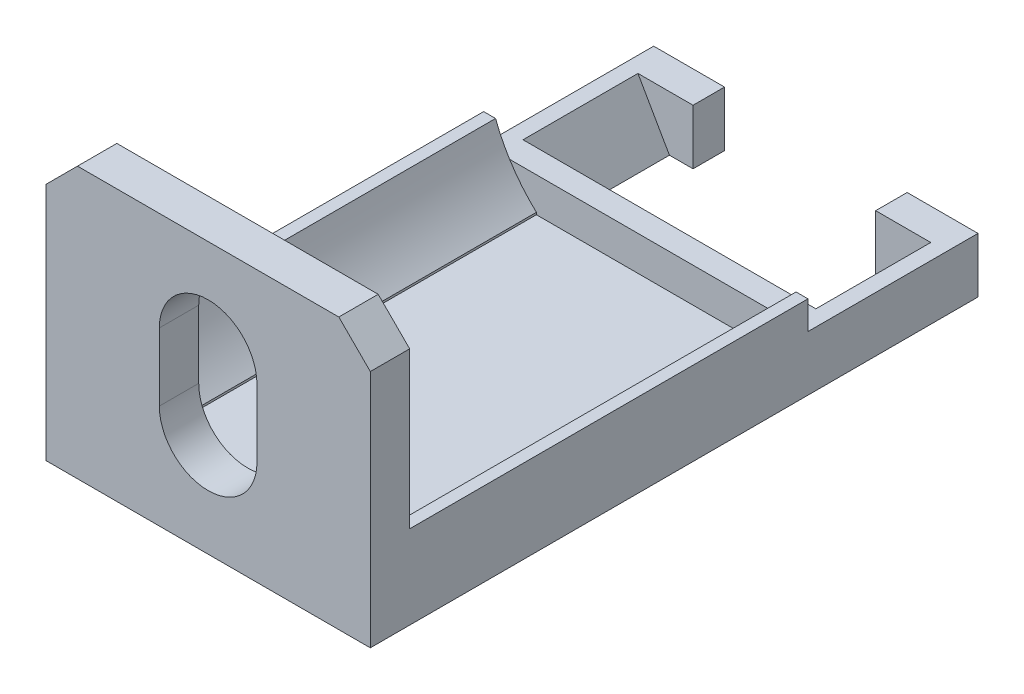
ISO-10303-21;
HEADER;
FILE_DESCRIPTION(('STEP AP214'),'2;1');
FILE_NAME('part.step','',(''),(''),'','','');
FILE_SCHEMA(('AUTOMOTIVE_DESIGN { 1 0 10303 214 1 1 1 1 }'));
ENDSEC;
DATA;
#1=APPLICATION_CONTEXT('core data for automotive mechanical design processes');
#2=APPLICATION_PROTOCOL_DEFINITION('international standard','automotive_design',2000,#1);
#3=PRODUCT_CONTEXT('',#1,'mechanical');
#4=PRODUCT('Part','Part','',(#3));
#5=PRODUCT_RELATED_PRODUCT_CATEGORY('part','',(#4));
#6=PRODUCT_DEFINITION_FORMATION('','',#4);
#7=PRODUCT_DEFINITION_CONTEXT('part definition',#1,'design');
#8=PRODUCT_DEFINITION('design','',#6,#7);
#9=PRODUCT_DEFINITION_SHAPE('','',#8);
#10=(LENGTH_UNIT() NAMED_UNIT(*) SI_UNIT(.MILLI.,.METRE.));
#11=(NAMED_UNIT(*) PLANE_ANGLE_UNIT() SI_UNIT($,.RADIAN.));
#12=(NAMED_UNIT(*) SI_UNIT($,.STERADIAN.) SOLID_ANGLE_UNIT());
#13=UNCERTAINTY_MEASURE_WITH_UNIT(LENGTH_MEASURE(1.E-05),#10,'distance_accuracy_value','');
#14=(GEOMETRIC_REPRESENTATION_CONTEXT(3) GLOBAL_UNCERTAINTY_ASSIGNED_CONTEXT((#13)) GLOBAL_UNIT_ASSIGNED_CONTEXT((#10,
#11,#12)) REPRESENTATION_CONTEXT('',''));
#15=CARTESIAN_POINT('',(0.,0.,0.));
#16=DIRECTION('',(0.,0.,1.));
#17=DIRECTION('',(1.,0.,0.));
#18=AXIS2_PLACEMENT_3D('',#15,#16,#17);
#19=CARTESIAN_POINT('',(0.,0.,-26.8));
#20=DIRECTION('',(0.,0.,1.));
#21=DIRECTION('',(1.,0.,0.));
#22=AXIS2_PLACEMENT_3D('',#19,#20,#21);
#23=PLANE('',#22);
#24=DIRECTION('',(0.496138938356835,-0.868243142124459,0.));
#25=VECTOR('',#24,1.);
#26=CARTESIAN_POINT('',(-9.3,-5.10000000000001,-26.8));
#27=LINE('',#26,#25);
#28=CARTESIAN_POINT('',(-9.3,-5.10000000000001,-26.8));
#29=VERTEX_POINT('',#28);
#30=CARTESIAN_POINT('',(-7.29999999999999,-8.6,-26.8));
#31=VERTEX_POINT('',#30);
#32=EDGE_CURVE('E276',#29,#31,#27,.T.);
#33=ORIENTED_EDGE('',*,*,#32,.F.);
#34=DIRECTION('',(1.,0.,0.));
#35=VECTOR('',#34,1.);
#36=CARTESIAN_POINT('',(10.3,-5.1,-26.8));
#37=LINE('',#36,#35);
#38=CARTESIAN_POINT('',(9.3,-5.1,-26.8));
#39=VERTEX_POINT('',#38);
#40=EDGE_CURVE('E359',#29,#39,#37,.T.);
#41=ORIENTED_EDGE('',*,*,#40,.T.);
#42=DIRECTION('',(0.496138938356834,0.868243142124459,0.));
#43=VECTOR('',#42,1.);
#44=CARTESIAN_POINT('',(9.3,-5.1,-26.8));
#45=LINE('',#44,#43);
#46=CARTESIAN_POINT('',(7.3,-8.6,-26.8));
#47=VERTEX_POINT('',#46);
#48=EDGE_CURVE('E291',#47,#39,#45,.T.);
#49=ORIENTED_EDGE('',*,*,#48,.F.);
#50=DIRECTION('',(-1.,0.,0.));
#51=VECTOR('',#50,1.);
#52=CARTESIAN_POINT('',(10.3,-8.6,-26.8));
#53=LINE('',#52,#51);
#54=EDGE_CURVE('E357',#47,#31,#53,.T.);
#55=ORIENTED_EDGE('',*,*,#54,.T.);
#56=EDGE_LOOP('',(#33,#41,#49,#55));
#57=FACE_BOUND('',#56,.T.);
#58=ADVANCED_FACE('F37',(#57),#23,.F.);
#59=CARTESIAN_POINT('',(-6.95,-3.3,0.));
#60=DIRECTION('',(-1.,0.,0.));
#61=DIRECTION('',(0.,0.,1.));
#62=AXIS2_PLACEMENT_3D('',#59,#60,#61);
#63=PLANE('',#62);
#64=DIRECTION('',(0.,0.,1.));
#65=VECTOR('',#64,1.);
#66=CARTESIAN_POINT('',(-6.95,-7.16575515269554,-51.1644543727487));
#67=LINE('',#66,#65);
#68=CARTESIAN_POINT('',(-6.95,-7.16575515269554,0.));
#69=VERTEX_POINT('',#68);
#70=CARTESIAN_POINT('',(-6.95,-7.16575515269554,-25.3));
#71=VERTEX_POINT('',#70);
#72=EDGE_CURVE('E319',#69,#71,#67,.F.);
#73=ORIENTED_EDGE('',*,*,#72,.F.);
#74=DIRECTION('',(0.,-1.,0.));
#75=VECTOR('',#74,1.);
#76=CARTESIAN_POINT('',(-6.95,-3.3,0.));
#77=LINE('',#76,#75);
#78=CARTESIAN_POINT('',(-6.95,-7.3,0.));
#79=VERTEX_POINT('',#78);
#80=EDGE_CURVE('E354',#69,#79,#77,.T.);
#81=ORIENTED_EDGE('',*,*,#80,.T.);
#82=DIRECTION('',(0.,0.,-1.));
#83=VECTOR('',#82,1.);
#84=CARTESIAN_POINT('',(-6.95,-7.3,0.));
#85=LINE('',#84,#83);
#86=CARTESIAN_POINT('',(-6.95,-7.3,-25.3));
#87=VERTEX_POINT('',#86);
#88=EDGE_CURVE('E340',#79,#87,#85,.T.);
#89=ORIENTED_EDGE('',*,*,#88,.T.);
#90=DIRECTION('',(0.,-1.,0.));
#91=VECTOR('',#90,1.);
#92=CARTESIAN_POINT('',(-6.95,0.,-25.3));
#93=LINE('',#92,#91);
#94=EDGE_CURVE('E427',#71,#87,#93,.T.);
#95=ORIENTED_EDGE('',*,*,#94,.F.);
#96=EDGE_LOOP('',(#73,#81,#89,#95));
#97=FACE_BOUND('',#96,.T.);
#98=ADVANCED_FACE('F524',(#97),#63,.F.);
#99=CARTESIAN_POINT('',(0.,-3.3,0.));
#100=DIRECTION('',(0.,1.,0.));
#101=DIRECTION('',(-1.,0.,0.));
#102=AXIS2_PLACEMENT_3D('',#99,#100,#101);
#103=PLANE('',#102);
#104=DIRECTION('',(1.,0.,0.));
#105=VECTOR('',#104,1.);
#106=CARTESIAN_POINT('',(0.,-3.3,0.));
#107=LINE('',#106,#105);
#108=CARTESIAN_POINT('',(-10.3,-3.3,0.));
#109=VERTEX_POINT('',#108);
#110=CARTESIAN_POINT('',(-9.54358423235212,-3.3,0.));
#111=VERTEX_POINT('',#110);
#112=EDGE_CURVE('E341',#109,#111,#107,.T.);
#113=ORIENTED_EDGE('',*,*,#112,.T.);
#114=DIRECTION('',(0.,0.,1.));
#115=VECTOR('',#114,1.);
#116=CARTESIAN_POINT('',(-9.54358423235212,-3.3,-51.1644543727487));
#117=LINE('',#116,#115);
#118=CARTESIAN_POINT('',(-9.54358423235212,-3.3,-25.3));
#119=VERTEX_POINT('',#118);
#120=EDGE_CURVE('E432',#111,#119,#117,.F.);
#121=ORIENTED_EDGE('',*,*,#120,.T.);
#122=DIRECTION('',(-1.,0.,0.));
#123=VECTOR('',#122,1.);
#124=CARTESIAN_POINT('',(0.,-3.3,-25.3));
#125=LINE('',#124,#123);
#126=CARTESIAN_POINT('',(-10.3,-3.3,-25.3));
#127=VERTEX_POINT('',#126);
#128=EDGE_CURVE('E344',#119,#127,#125,.T.);
#129=ORIENTED_EDGE('',*,*,#128,.T.);
#130=DIRECTION('',(0.,0.,1.));
#131=VECTOR('',#130,1.);
#132=CARTESIAN_POINT('',(-10.3,-3.3,0.));
#133=LINE('',#132,#131);
#134=EDGE_CURVE('E346',#127,#109,#133,.T.);
#135=ORIENTED_EDGE('',*,*,#134,.T.);
#136=EDGE_LOOP('',(#113,#121,#129,#135));
#137=FACE_BOUND('',#136,.T.);
#138=ADVANCED_FACE('F518',(#137),#103,.T.);
#139=CARTESIAN_POINT('',(6.95,-3.3,0.));
#140=DIRECTION('',(-1.,0.,0.));
#141=DIRECTION('',(0.,0.,1.));
#142=AXIS2_PLACEMENT_3D('',#139,#140,#141);
#143=PLANE('',#142);
#144=DIRECTION('',(0.,-1.,0.));
#145=VECTOR('',#144,1.);
#146=CARTESIAN_POINT('',(6.95,-3.3,0.));
#147=LINE('',#146,#145);
#148=CARTESIAN_POINT('',(6.95,-7.16575515269554,0.));
#149=VERTEX_POINT('',#148);
#150=CARTESIAN_POINT('',(6.95,-7.3,0.));
#151=VERTEX_POINT('',#150);
#152=EDGE_CURVE('E337',#149,#151,#147,.T.);
#153=ORIENTED_EDGE('',*,*,#152,.F.);
#154=DIRECTION('',(0.,0.,1.));
#155=VECTOR('',#154,1.);
#156=CARTESIAN_POINT('',(6.95,-7.16575515269554,-51.1644543727487));
#157=LINE('',#156,#155);
#158=CARTESIAN_POINT('',(6.95,-7.16575515269554,-25.3));
#159=VERTEX_POINT('',#158);
#160=EDGE_CURVE('E316',#149,#159,#157,.F.);
#161=ORIENTED_EDGE('',*,*,#160,.T.);
#162=DIRECTION('',(0.,-1.,0.));
#163=VECTOR('',#162,1.);
#164=CARTESIAN_POINT('',(6.95,-3.3,-25.3));
#165=LINE('',#164,#163);
#166=CARTESIAN_POINT('',(6.95,-7.3,-25.3));
#167=VERTEX_POINT('',#166);
#168=EDGE_CURVE('E329',#159,#167,#165,.T.);
#169=ORIENTED_EDGE('',*,*,#168,.T.);
#170=DIRECTION('',(0.,0.,-1.));
#171=VECTOR('',#170,1.);
#172=CARTESIAN_POINT('',(6.95,-7.3,0.));
#173=LINE('',#172,#171);
#174=EDGE_CURVE('E321',#151,#167,#173,.T.);
#175=ORIENTED_EDGE('',*,*,#174,.F.);
#176=EDGE_LOOP('',(#153,#161,#169,#175));
#177=FACE_BOUND('',#176,.T.);
#178=ADVANCED_FACE('F545',(#177),#143,.T.);
#179=CARTESIAN_POINT('',(0.,-3.3,0.));
#180=DIRECTION('',(0.,1.,0.));
#181=DIRECTION('',(-1.,0.,0.));
#182=AXIS2_PLACEMENT_3D('',#179,#180,#181);
#183=PLANE('',#182);
#184=DIRECTION('',(-1.,0.,0.));
#185=VECTOR('',#184,1.);
#186=CARTESIAN_POINT('',(0.,-3.3,-25.3));
#187=LINE('',#186,#185);
#188=CARTESIAN_POINT('',(10.3,-3.3,-25.3));
#189=VERTEX_POINT('',#188);
#190=CARTESIAN_POINT('',(9.54358423235212,-3.3,-25.3));
#191=VERTEX_POINT('',#190);
#192=EDGE_CURVE('E326',#189,#191,#187,.T.);
#193=ORIENTED_EDGE('',*,*,#192,.T.);
#194=DIRECTION('',(0.,0.,1.));
#195=VECTOR('',#194,1.);
#196=CARTESIAN_POINT('',(9.54358423235212,-3.3,-51.1644543727487));
#197=LINE('',#196,#195);
#198=CARTESIAN_POINT('',(9.54358423235212,-3.3,0.));
#199=VERTEX_POINT('',#198);
#200=EDGE_CURVE('E429',#191,#199,#197,.T.);
#201=ORIENTED_EDGE('',*,*,#200,.T.);
#202=DIRECTION('',(1.,0.,0.));
#203=VECTOR('',#202,1.);
#204=CARTESIAN_POINT('',(0.,-3.3,0.));
#205=LINE('',#204,#203);
#206=CARTESIAN_POINT('',(10.3,-3.3,0.));
#207=VERTEX_POINT('',#206);
#208=EDGE_CURVE('E322',#199,#207,#205,.T.);
#209=ORIENTED_EDGE('',*,*,#208,.T.);
#210=DIRECTION('',(0.,0.,-1.));
#211=VECTOR('',#210,1.);
#212=CARTESIAN_POINT('',(10.3,-3.3,0.));
#213=LINE('',#212,#211);
#214=EDGE_CURVE('E324',#207,#189,#213,.T.);
#215=ORIENTED_EDGE('',*,*,#214,.T.);
#216=EDGE_LOOP('',(#193,#201,#209,#215));
#217=FACE_BOUND('',#216,.T.);
#218=ADVANCED_FACE('F541',(#217),#183,.T.);
#219=CARTESIAN_POINT('',(0.,0.,0.));
#220=DIRECTION('',(0.,0.,-1.));
#221=DIRECTION('',(-1.,0.,0.));
#222=AXIS2_PLACEMENT_3D('',#219,#220,#221);
#223=PLANE('',#222);
#224=DIRECTION('',(0.,-1.,0.));
#225=VECTOR('',#224,1.);
#226=CARTESIAN_POINT('',(-10.3,-8.6,0.));
#227=LINE('',#226,#225);
#228=CARTESIAN_POINT('',(-10.3,6.6,0.));
#229=VERTEX_POINT('',#228);
#230=EDGE_CURVE('E410',#229,#109,#227,.T.);
#231=ORIENTED_EDGE('',*,*,#230,.F.);
#232=DIRECTION('',(-0.707106781186549,-0.707106781186546,0.));
#233=VECTOR('',#232,1.);
#234=CARTESIAN_POINT('',(-8.44999999999998,8.45000000000001,0.));
#235=LINE('',#234,#233);
#236=CARTESIAN_POINT('',(-8.3,8.6,0.));
#237=VERTEX_POINT('',#236);
#238=EDGE_CURVE('E440',#229,#237,#235,.F.);
#239=ORIENTED_EDGE('',*,*,#238,.T.);
#240=DIRECTION('',(-1.,0.,0.));
#241=VECTOR('',#240,1.);
#242=CARTESIAN_POINT('',(-10.3,8.6,0.));
#243=LINE('',#242,#241);
#244=CARTESIAN_POINT('',(8.3,8.6,0.));
#245=VERTEX_POINT('',#244);
#246=EDGE_CURVE('E420',#245,#237,#243,.T.);
#247=ORIENTED_EDGE('',*,*,#246,.F.);
#248=DIRECTION('',(-0.707106781186546,0.707106781186549,0.));
#249=VECTOR('',#248,1.);
#250=CARTESIAN_POINT('',(8.45000000000002,8.44999999999999,0.));
#251=LINE('',#250,#249);
#252=CARTESIAN_POINT('',(10.3,6.59999999999999,0.));
#253=VERTEX_POINT('',#252);
#254=EDGE_CURVE('E438',#245,#253,#251,.F.);
#255=ORIENTED_EDGE('',*,*,#254,.T.);
#256=DIRECTION('',(0.,1.,0.));
#257=VECTOR('',#256,1.);
#258=CARTESIAN_POINT('',(10.3,-8.6,0.));
#259=LINE('',#258,#257);
#260=EDGE_CURVE('E405',#207,#253,#259,.T.);
#261=ORIENTED_EDGE('',*,*,#260,.F.);
#262=ORIENTED_EDGE('',*,*,#208,.F.);
#263=CARTESIAN_POINT('',(0.,0.3,0.));
#264=DIRECTION('',(0.,0.,-1.));
#265=DIRECTION('',(-1.,0.,0.));
#266=AXIS2_PLACEMENT_3D('',#263,#264,#265);
#267=CIRCLE('',#266,10.2);
#268=EDGE_CURVE('E304',#199,#149,#267,.T.);
#269=ORIENTED_EDGE('',*,*,#268,.T.);
#270=ORIENTED_EDGE('',*,*,#152,.T.);
#271=DIRECTION('',(1.,0.,0.));
#272=VECTOR('',#271,1.);
#273=CARTESIAN_POINT('',(10.3,-7.3,0.));
#274=LINE('',#273,#272);
#275=EDGE_CURVE('E370',#79,#151,#274,.T.);
#276=ORIENTED_EDGE('',*,*,#275,.F.);
#277=ORIENTED_EDGE('',*,*,#80,.F.);
#278=EDGE_CURVE('E310',#69,#111,#267,.T.);
#279=ORIENTED_EDGE('',*,*,#278,.T.);
#280=ORIENTED_EDGE('',*,*,#112,.F.);
#281=EDGE_LOOP('',(#231,#239,#247,#255,#261,#262,#269,#270,#276,#277,#279,#280));
#282=FACE_BOUND('',#281,.T.);
#283=DIRECTION('',(0.,1.,0.));
#284=VECTOR('',#283,1.);
#285=CARTESIAN_POINT('',(3.1,2.3,0.));
#286=LINE('',#285,#284);
#287=CARTESIAN_POINT('',(3.1,-2.,0.));
#288=VERTEX_POINT('',#287);
#289=CARTESIAN_POINT('',(3.1,2.3,0.));
#290=VERTEX_POINT('',#289);
#291=EDGE_CURVE('E378',#288,#290,#286,.T.);
#292=ORIENTED_EDGE('',*,*,#291,.T.);
#293=CARTESIAN_POINT('',(0.,2.3,0.));
#294=DIRECTION('',(0.,0.,1.));
#295=DIRECTION('',(1.,0.,0.));
#296=AXIS2_PLACEMENT_3D('',#293,#294,#295);
#297=CIRCLE('',#296,3.1);
#298=CARTESIAN_POINT('',(-3.1,2.3,0.));
#299=VERTEX_POINT('',#298);
#300=EDGE_CURVE('E373',#290,#299,#297,.T.);
#301=ORIENTED_EDGE('',*,*,#300,.T.);
#302=DIRECTION('',(0.,-1.,0.));
#303=VECTOR('',#302,1.);
#304=CARTESIAN_POINT('',(-3.1,2.3,0.));
#305=LINE('',#304,#303);
#306=CARTESIAN_POINT('',(-3.1,-2.,0.));
#307=VERTEX_POINT('',#306);
#308=EDGE_CURVE('E388',#299,#307,#305,.T.);
#309=ORIENTED_EDGE('',*,*,#308,.T.);
#310=CARTESIAN_POINT('',(0.,-2.,0.));
#311=DIRECTION('',(0.,0.,1.));
#312=DIRECTION('',(1.,0.,0.));
#313=AXIS2_PLACEMENT_3D('',#310,#311,#312);
#314=CIRCLE('',#313,3.1);
#315=EDGE_CURVE('E391',#307,#288,#314,.T.);
#316=ORIENTED_EDGE('',*,*,#315,.T.);
#317=EDGE_LOOP('',(#292,#301,#309,#316));
#318=FACE_BOUND('',#317,.T.);
#319=ADVANCED_FACE('F492',(#282,#318),#223,.T.);
#320=CARTESIAN_POINT('',(10.3,-7.3,-25.3));
#321=DIRECTION('',(0.,-1.,0.));
#322=DIRECTION('',(1.,0.,0.));
#323=AXIS2_PLACEMENT_3D('',#320,#321,#322);
#324=PLANE('',#323);
#325=ORIENTED_EDGE('',*,*,#174,.T.);
#326=DIRECTION('',(1.,0.,0.));
#327=VECTOR('',#326,1.);
#328=CARTESIAN_POINT('',(10.3,-7.3,-25.3));
#329=LINE('',#328,#327);
#330=EDGE_CURVE('E371',#87,#167,#329,.T.);
#331=ORIENTED_EDGE('',*,*,#330,.F.);
#332=ORIENTED_EDGE('',*,*,#88,.F.);
#333=ORIENTED_EDGE('',*,*,#275,.T.);
#334=EDGE_LOOP('',(#325,#331,#332,#333));
#335=FACE_BOUND('',#334,.T.);
#336=ADVANCED_FACE('F548',(#335),#324,.F.);
#337=CARTESIAN_POINT('',(0.,0.,-25.3));
#338=DIRECTION('',(0.,0.,1.));
#339=DIRECTION('',(1.,0.,0.));
#340=AXIS2_PLACEMENT_3D('',#337,#338,#339);
#341=PLANE('',#340);
#342=ORIENTED_EDGE('',*,*,#168,.F.);
#343=CARTESIAN_POINT('',(0.,0.3,-25.3));
#344=DIRECTION('',(0.,0.,1.));
#345=DIRECTION('',(1.,0.,0.));
#346=AXIS2_PLACEMENT_3D('',#343,#344,#345);
#347=CIRCLE('',#346,10.2);
#348=CARTESIAN_POINT('',(8.65332306111357,-5.1,-25.3));
#349=VERTEX_POINT('',#348);
#350=EDGE_CURVE('E308',#159,#349,#347,.T.);
#351=ORIENTED_EDGE('',*,*,#350,.T.);
#352=DIRECTION('',(1.,0.,0.));
#353=VECTOR('',#352,1.);
#354=CARTESIAN_POINT('',(10.3,-5.1,-25.3));
#355=LINE('',#354,#353);
#356=CARTESIAN_POINT('',(-8.65332306111357,-5.1,-25.3));
#357=VERTEX_POINT('',#356);
#358=EDGE_CURVE('E366',#357,#349,#355,.T.);
#359=ORIENTED_EDGE('',*,*,#358,.F.);
#360=CARTESIAN_POINT('',(0.,0.3,-25.3));
#361=DIRECTION('',(0.,0.,1.));
#362=DIRECTION('',(1.,0.,0.));
#363=AXIS2_PLACEMENT_3D('',#360,#361,#362);
#364=CIRCLE('',#363,10.2);
#365=EDGE_CURVE('E313',#357,#71,#364,.T.);
#366=ORIENTED_EDGE('',*,*,#365,.T.);
#367=ORIENTED_EDGE('',*,*,#94,.T.);
#368=ORIENTED_EDGE('',*,*,#330,.T.);
#369=EDGE_LOOP('',(#342,#351,#359,#366,#367,#368));
#370=FACE_BOUND('',#369,.T.);
#371=ADVANCED_FACE('F529',(#370),#341,.T.);
#372=CARTESIAN_POINT('',(0.,0.,2.5));
#373=DIRECTION('',(0.,0.,-1.));
#374=DIRECTION('',(-1.,0.,0.));
#375=AXIS2_PLACEMENT_3D('',#372,#373,#374);
#376=PLANE('',#375);
#377=DIRECTION('',(-1.,0.,0.));
#378=VECTOR('',#377,1.);
#379=CARTESIAN_POINT('',(-10.3,8.6,2.5));
#380=LINE('',#379,#378);
#381=CARTESIAN_POINT('',(8.3,8.6,2.5));
#382=VERTEX_POINT('',#381);
#383=CARTESIAN_POINT('',(-8.3,8.6,2.5));
#384=VERTEX_POINT('',#383);
#385=EDGE_CURVE('E409',#382,#384,#380,.T.);
#386=ORIENTED_EDGE('',*,*,#385,.T.);
#387=DIRECTION('',(0.707106781186549,0.707106781186546,0.));
#388=VECTOR('',#387,1.);
#389=CARTESIAN_POINT('',(-10.3,6.6,2.5));
#390=LINE('',#389,#388);
#391=CARTESIAN_POINT('',(-10.3,6.6,2.5));
#392=VERTEX_POINT('',#391);
#393=EDGE_CURVE('E449',#384,#392,#390,.F.);
#394=ORIENTED_EDGE('',*,*,#393,.T.);
#395=DIRECTION('',(0.,-1.,0.));
#396=VECTOR('',#395,1.);
#397=CARTESIAN_POINT('',(-10.3,-8.6,2.5));
#398=LINE('',#397,#396);
#399=CARTESIAN_POINT('',(-10.3,-8.6,2.5));
#400=VERTEX_POINT('',#399);
#401=EDGE_CURVE('E413',#392,#400,#398,.T.);
#402=ORIENTED_EDGE('',*,*,#401,.T.);
#403=DIRECTION('',(1.,0.,0.));
#404=VECTOR('',#403,1.);
#405=CARTESIAN_POINT('',(-10.3,-8.6,2.5));
#406=LINE('',#405,#404);
#407=CARTESIAN_POINT('',(10.3,-8.6,2.5));
#408=VERTEX_POINT('',#407);
#409=EDGE_CURVE('E415',#400,#408,#406,.T.);
#410=ORIENTED_EDGE('',*,*,#409,.T.);
#411=DIRECTION('',(0.,1.,0.));
#412=VECTOR('',#411,1.);
#413=CARTESIAN_POINT('',(10.3,-8.6,2.5));
#414=LINE('',#413,#412);
#415=CARTESIAN_POINT('',(10.3,6.59999999999999,2.5));
#416=VERTEX_POINT('',#415);
#417=EDGE_CURVE('E406',#408,#416,#414,.T.);
#418=ORIENTED_EDGE('',*,*,#417,.T.);
#419=DIRECTION('',(0.707106781186546,-0.707106781186549,0.));
#420=VECTOR('',#419,1.);
#421=CARTESIAN_POINT('',(8.3,8.6,2.5));
#422=LINE('',#421,#420);
#423=EDGE_CURVE('E447',#416,#382,#422,.F.);
#424=ORIENTED_EDGE('',*,*,#423,.T.);
#425=EDGE_LOOP('',(#386,#394,#402,#410,#418,#424));
#426=FACE_BOUND('',#425,.T.);
#427=CARTESIAN_POINT('',(0.,2.3,2.5));
#428=DIRECTION('',(0.,0.,1.));
#429=DIRECTION('',(1.,0.,0.));
#430=AXIS2_PLACEMENT_3D('',#427,#428,#429);
#431=CIRCLE('',#430,3.1);
#432=CARTESIAN_POINT('',(3.1,2.3,2.5));
#433=VERTEX_POINT('',#432);
#434=CARTESIAN_POINT('',(-3.1,2.3,2.5));
#435=VERTEX_POINT('',#434);
#436=EDGE_CURVE('E375',#433,#435,#431,.T.);
#437=ORIENTED_EDGE('',*,*,#436,.F.);
#438=DIRECTION('',(0.,1.,0.));
#439=VECTOR('',#438,1.);
#440=CARTESIAN_POINT('',(3.1,2.3,2.5));
#441=LINE('',#440,#439);
#442=CARTESIAN_POINT('',(3.1,-2.,2.5));
#443=VERTEX_POINT('',#442);
#444=EDGE_CURVE('E383',#443,#433,#441,.T.);
#445=ORIENTED_EDGE('',*,*,#444,.F.);
#446=CARTESIAN_POINT('',(0.,-2.,2.5));
#447=DIRECTION('',(0.,0.,1.));
#448=DIRECTION('',(1.,0.,0.));
#449=AXIS2_PLACEMENT_3D('',#446,#447,#448);
#450=CIRCLE('',#449,3.1);
#451=CARTESIAN_POINT('',(-3.1,-2.,2.5));
#452=VERTEX_POINT('',#451);
#453=EDGE_CURVE('E380',#452,#443,#450,.T.);
#454=ORIENTED_EDGE('',*,*,#453,.F.);
#455=DIRECTION('',(0.,-1.,0.));
#456=VECTOR('',#455,1.);
#457=CARTESIAN_POINT('',(-3.1,2.3,2.5));
#458=LINE('',#457,#456);
#459=EDGE_CURVE('E377',#435,#452,#458,.T.);
#460=ORIENTED_EDGE('',*,*,#459,.F.);
#461=EDGE_LOOP('',(#437,#445,#454,#460));
#462=FACE_BOUND('',#461,.T.);
#463=ADVANCED_FACE('F481',(#426,#462),#376,.F.);
#464=CARTESIAN_POINT('',(10.3,-8.6,2.5));
#465=DIRECTION('',(-1.,0.,0.));
#466=DIRECTION('',(0.,0.,1.));
#467=AXIS2_PLACEMENT_3D('',#464,#465,#466);
#468=PLANE('',#467);
#469=DIRECTION('',(0.,0.,-1.));
#470=VECTOR('',#469,1.);
#471=CARTESIAN_POINT('',(10.3,-8.6,2.5));
#472=LINE('',#471,#470);
#473=CARTESIAN_POINT('',(10.3,-8.6,-36.1));
#474=VERTEX_POINT('',#473);
#475=EDGE_CURVE('E417',#408,#474,#472,.T.);
#476=ORIENTED_EDGE('',*,*,#475,.T.);
#477=DIRECTION('',(0.,-1.,0.));
#478=VECTOR('',#477,1.);
#479=CARTESIAN_POINT('',(10.3,-8.6,-36.1));
#480=LINE('',#479,#478);
#481=CARTESIAN_POINT('',(10.3,-5.1,-36.1));
#482=VERTEX_POINT('',#481);
#483=EDGE_CURVE('E295',#482,#474,#480,.T.);
#484=ORIENTED_EDGE('',*,*,#483,.F.);
#485=DIRECTION('',(0.,0.,1.));
#486=VECTOR('',#485,1.);
#487=CARTESIAN_POINT('',(10.3,-5.1,-26.8));
#488=LINE('',#487,#486);
#489=CARTESIAN_POINT('',(10.3,-5.1,-25.3));
#490=VERTEX_POINT('',#489);
#491=EDGE_CURVE('E363',#482,#490,#488,.T.);
#492=ORIENTED_EDGE('',*,*,#491,.T.);
#493=DIRECTION('',(0.,-1.,0.));
#494=VECTOR('',#493,1.);
#495=CARTESIAN_POINT('',(10.3,-3.3,-25.3));
#496=LINE('',#495,#494);
#497=EDGE_CURVE('E334',#189,#490,#496,.T.);
#498=ORIENTED_EDGE('',*,*,#497,.F.);
#499=ORIENTED_EDGE('',*,*,#214,.F.);
#500=ORIENTED_EDGE('',*,*,#260,.T.);
#501=DIRECTION('',(0.,0.,1.));
#502=VECTOR('',#501,1.);
#503=CARTESIAN_POINT('',(10.3,6.59999999999999,2.5));
#504=LINE('',#503,#502);
#505=EDGE_CURVE('E451',#253,#416,#504,.T.);
#506=ORIENTED_EDGE('',*,*,#505,.T.);
#507=ORIENTED_EDGE('',*,*,#417,.F.);
#508=EDGE_LOOP('',(#476,#484,#492,#498,#499,#500,#506,#507));
#509=FACE_BOUND('',#508,.T.);
#510=ADVANCED_FACE('F475',(#509),#468,.F.);
#511=CARTESIAN_POINT('',(-10.3,8.6,2.5));
#512=DIRECTION('',(0.,-1.,0.));
#513=DIRECTION('',(0.,0.,-1.));
#514=AXIS2_PLACEMENT_3D('',#511,#512,#513);
#515=PLANE('',#514);
#516=ORIENTED_EDGE('',*,*,#246,.T.);
#517=DIRECTION('',(0.,0.,1.));
#518=VECTOR('',#517,1.);
#519=CARTESIAN_POINT('',(-8.3,8.6,2.5));
#520=LINE('',#519,#518);
#521=EDGE_CURVE('E445',#237,#384,#520,.T.);
#522=ORIENTED_EDGE('',*,*,#521,.T.);
#523=ORIENTED_EDGE('',*,*,#385,.F.);
#524=DIRECTION('',(0.,0.,-1.));
#525=VECTOR('',#524,1.);
#526=CARTESIAN_POINT('',(8.3,8.6,2.5));
#527=LINE('',#526,#525);
#528=EDGE_CURVE('E442',#382,#245,#527,.T.);
#529=ORIENTED_EDGE('',*,*,#528,.T.);
#530=EDGE_LOOP('',(#516,#522,#523,#529));
#531=FACE_BOUND('',#530,.T.);
#532=ADVANCED_FACE('F488',(#531),#515,.F.);
#533=CARTESIAN_POINT('',(-10.3,-8.6,2.5));
#534=DIRECTION('',(1.,0.,0.));
#535=DIRECTION('',(0.,0.,-1.));
#536=AXIS2_PLACEMENT_3D('',#533,#534,#535);
#537=PLANE('',#536);
#538=DIRECTION('',(0.,-1.,0.));
#539=VECTOR('',#538,1.);
#540=CARTESIAN_POINT('',(-10.3,-3.3,-25.3));
#541=LINE('',#540,#539);
#542=CARTESIAN_POINT('',(-10.3,-5.1,-25.3));
#543=VERTEX_POINT('',#542);
#544=EDGE_CURVE('E349',#127,#543,#541,.T.);
#545=ORIENTED_EDGE('',*,*,#544,.T.);
#546=DIRECTION('',(0.,0.,1.));
#547=VECTOR('',#546,1.);
#548=CARTESIAN_POINT('',(-10.3,-5.1,-26.8));
#549=LINE('',#548,#547);
#550=CARTESIAN_POINT('',(-10.3,-5.10000000000001,-36.1));
#551=VERTEX_POINT('',#550);
#552=EDGE_CURVE('E368',#551,#543,#549,.T.);
#553=ORIENTED_EDGE('',*,*,#552,.F.);
#554=DIRECTION('',(0.,1.,0.));
#555=VECTOR('',#554,1.);
#556=CARTESIAN_POINT('',(-10.3,-8.60000000000001,-36.1));
#557=LINE('',#556,#555);
#558=CARTESIAN_POINT('',(-10.3,-8.60000000000001,-36.1));
#559=VERTEX_POINT('',#558);
#560=EDGE_CURVE('E284',#559,#551,#557,.T.);
#561=ORIENTED_EDGE('',*,*,#560,.F.);
#562=DIRECTION('',(0.,0.,-1.));
#563=VECTOR('',#562,1.);
#564=CARTESIAN_POINT('',(-10.3,-8.6,2.5));
#565=LINE('',#564,#563);
#566=EDGE_CURVE('E425',#400,#559,#565,.T.);
#567=ORIENTED_EDGE('',*,*,#566,.F.);
#568=ORIENTED_EDGE('',*,*,#401,.F.);
#569=DIRECTION('',(0.,0.,-1.));
#570=VECTOR('',#569,1.);
#571=CARTESIAN_POINT('',(-10.3,6.6,2.5));
#572=LINE('',#571,#570);
#573=EDGE_CURVE('E435',#392,#229,#572,.T.);
#574=ORIENTED_EDGE('',*,*,#573,.T.);
#575=ORIENTED_EDGE('',*,*,#230,.T.);
#576=ORIENTED_EDGE('',*,*,#134,.F.);
#577=EDGE_LOOP('',(#545,#553,#561,#567,#568,#574,#575,#576));
#578=FACE_BOUND('',#577,.T.);
#579=ADVANCED_FACE('F502',(#578),#537,.F.);
#580=CARTESIAN_POINT('',(-10.3,-8.6,2.5));
#581=DIRECTION('',(0.,1.,0.));
#582=DIRECTION('',(0.,0.,1.));
#583=AXIS2_PLACEMENT_3D('',#580,#581,#582);
#584=PLANE('',#583);
#585=ORIENTED_EDGE('',*,*,#566,.T.);
#586=DIRECTION('',(-1.,0.,0.));
#587=VECTOR('',#586,1.);
#588=CARTESIAN_POINT('',(-7.29999999999999,-8.6,-36.1));
#589=LINE('',#588,#587);
#590=CARTESIAN_POINT('',(-5.79999999999999,-8.60000000000001,-36.1));
#591=VERTEX_POINT('',#590);
#592=EDGE_CURVE('E281',#591,#559,#589,.T.);
#593=ORIENTED_EDGE('',*,*,#592,.F.);
#594=DIRECTION('',(0.,0.,-1.));
#595=VECTOR('',#594,1.);
#596=CARTESIAN_POINT('',(-5.79999999999999,-8.60000000000001,-34.1));
#597=LINE('',#596,#595);
#598=CARTESIAN_POINT('',(-5.79999999999999,-8.60000000000001,-34.1));
#599=VERTEX_POINT('',#598);
#600=EDGE_CURVE('E252',#599,#591,#597,.T.);
#601=ORIENTED_EDGE('',*,*,#600,.F.);
#602=DIRECTION('',(-1.,0.,0.));
#603=VECTOR('',#602,1.);
#604=CARTESIAN_POINT('',(-10.3,-8.60000000000002,-34.1));
#605=LINE('',#604,#603);
#606=CARTESIAN_POINT('',(-7.29999999999999,-8.60000000000001,-34.1));
#607=VERTEX_POINT('',#606);
#608=EDGE_CURVE('E244',#599,#607,#605,.T.);
#609=ORIENTED_EDGE('',*,*,#608,.T.);
#610=DIRECTION('',(0.,0.,1.));
#611=VECTOR('',#610,1.);
#612=CARTESIAN_POINT('',(-7.29999999999999,-8.6,-36.1));
#613=LINE('',#612,#611);
#614=EDGE_CURVE('E53',#607,#31,#613,.T.);
#615=ORIENTED_EDGE('',*,*,#614,.T.);
#616=ORIENTED_EDGE('',*,*,#54,.F.);
#617=DIRECTION('',(0.,0.,1.));
#618=VECTOR('',#617,1.);
#619=CARTESIAN_POINT('',(7.3,-8.6,-36.1));
#620=LINE('',#619,#618);
#621=CARTESIAN_POINT('',(7.3,-8.6,-34.1));
#622=VERTEX_POINT('',#621);
#623=EDGE_CURVE('E61',#622,#47,#620,.T.);
#624=ORIENTED_EDGE('',*,*,#623,.F.);
#625=DIRECTION('',(-1.,0.,0.));
#626=VECTOR('',#625,1.);
#627=CARTESIAN_POINT('',(10.3,-8.6,-34.1));
#628=LINE('',#627,#626);
#629=CARTESIAN_POINT('',(5.8,-8.6,-34.1));
#630=VERTEX_POINT('',#629);
#631=EDGE_CURVE('E262',#622,#630,#628,.T.);
#632=ORIENTED_EDGE('',*,*,#631,.T.);
#633=DIRECTION('',(0.,0.,-1.));
#634=VECTOR('',#633,1.);
#635=CARTESIAN_POINT('',(5.8,-8.6,-34.1));
#636=LINE('',#635,#634);
#637=CARTESIAN_POINT('',(5.8,-8.6,-36.1));
#638=VERTEX_POINT('',#637);
#639=EDGE_CURVE('E270',#630,#638,#636,.T.);
#640=ORIENTED_EDGE('',*,*,#639,.T.);
#641=DIRECTION('',(-1.,0.,0.));
#642=VECTOR('',#641,1.);
#643=CARTESIAN_POINT('',(7.3,-8.6,-36.1));
#644=LINE('',#643,#642);
#645=EDGE_CURVE('E298',#474,#638,#644,.T.);
#646=ORIENTED_EDGE('',*,*,#645,.F.);
#647=ORIENTED_EDGE('',*,*,#475,.F.);
#648=ORIENTED_EDGE('',*,*,#409,.F.);
#649=EDGE_LOOP('',(#585,#593,#601,#609,#615,#616,#624,#632,#640,#646,#647,#648));
#650=FACE_BOUND('',#649,.T.);
#651=ADVANCED_FACE('F456',(#650),#584,.F.);
#652=CARTESIAN_POINT('',(0.,2.3,2.5));
#653=DIRECTION('',(0.,0.,-1.));
#654=DIRECTION('',(-1.,0.,0.));
#655=AXIS2_PLACEMENT_3D('',#652,#653,#654);
#656=CYLINDRICAL_SURFACE('',#655,3.1);
#657=ORIENTED_EDGE('',*,*,#300,.F.);
#658=DIRECTION('',(0.,0.,-1.));
#659=VECTOR('',#658,1.);
#660=CARTESIAN_POINT('',(3.1,2.3,2.5));
#661=LINE('',#660,#659);
#662=EDGE_CURVE('E385',#433,#290,#661,.T.);
#663=ORIENTED_EDGE('',*,*,#662,.F.);
#664=ORIENTED_EDGE('',*,*,#436,.T.);
#665=DIRECTION('',(0.,0.,-1.));
#666=VECTOR('',#665,1.);
#667=CARTESIAN_POINT('',(-3.1,2.3,2.5));
#668=LINE('',#667,#666);
#669=EDGE_CURVE('E402',#435,#299,#668,.T.);
#670=ORIENTED_EDGE('',*,*,#669,.T.);
#671=EDGE_LOOP('',(#657,#663,#664,#670));
#672=FACE_BOUND('',#671,.T.);
#673=ADVANCED_FACE('F584',(#672),#656,.F.);
#674=CARTESIAN_POINT('',(-3.1,2.3,2.5));
#675=DIRECTION('',(1.,0.,0.));
#676=DIRECTION('',(0.,1.,0.));
#677=AXIS2_PLACEMENT_3D('',#674,#675,#676);
#678=PLANE('',#677);
#679=ORIENTED_EDGE('',*,*,#308,.F.);
#680=ORIENTED_EDGE('',*,*,#669,.F.);
#681=ORIENTED_EDGE('',*,*,#459,.T.);
#682=DIRECTION('',(0.,0.,-1.));
#683=VECTOR('',#682,1.);
#684=CARTESIAN_POINT('',(-3.1,-2.,2.5));
#685=LINE('',#684,#683);
#686=EDGE_CURVE('E400',#452,#307,#685,.T.);
#687=ORIENTED_EDGE('',*,*,#686,.T.);
#688=EDGE_LOOP('',(#679,#680,#681,#687));
#689=FACE_BOUND('',#688,.T.);
#690=ADVANCED_FACE('F577',(#689),#678,.T.);
#691=CARTESIAN_POINT('',(0.,-2.,2.5));
#692=DIRECTION('',(0.,0.,-1.));
#693=DIRECTION('',(-1.,0.,0.));
#694=AXIS2_PLACEMENT_3D('',#691,#692,#693);
#695=CYLINDRICAL_SURFACE('',#694,3.1);
#696=ORIENTED_EDGE('',*,*,#315,.F.);
#697=ORIENTED_EDGE('',*,*,#686,.F.);
#698=ORIENTED_EDGE('',*,*,#453,.T.);
#699=DIRECTION('',(0.,0.,-1.));
#700=VECTOR('',#699,1.);
#701=CARTESIAN_POINT('',(3.1,-2.,2.5));
#702=LINE('',#701,#700);
#703=EDGE_CURVE('E398',#443,#288,#702,.T.);
#704=ORIENTED_EDGE('',*,*,#703,.T.);
#705=EDGE_LOOP('',(#696,#697,#698,#704));
#706=FACE_BOUND('',#705,.T.);
#707=ADVANCED_FACE('F572',(#706),#695,.F.);
#708=CARTESIAN_POINT('',(3.1,2.3,2.5));
#709=DIRECTION('',(-1.,0.,0.));
#710=DIRECTION('',(0.,-1.,0.));
#711=AXIS2_PLACEMENT_3D('',#708,#709,#710);
#712=PLANE('',#711);
#713=ORIENTED_EDGE('',*,*,#291,.F.);
#714=ORIENTED_EDGE('',*,*,#703,.F.);
#715=ORIENTED_EDGE('',*,*,#444,.T.);
#716=ORIENTED_EDGE('',*,*,#662,.T.);
#717=EDGE_LOOP('',(#713,#714,#715,#716));
#718=FACE_BOUND('',#717,.T.);
#719=ADVANCED_FACE('F567',(#718),#712,.T.);
#720=CARTESIAN_POINT('',(10.3,-5.1,-26.8));
#721=DIRECTION('',(0.,-1.,0.));
#722=DIRECTION('',(0.,0.,-1.));
#723=AXIS2_PLACEMENT_3D('',#720,#721,#722);
#724=PLANE('',#723);
#725=DIRECTION('',(0.,0.,1.));
#726=VECTOR('',#725,1.);
#727=CARTESIAN_POINT('',(-9.3,-5.10000000000001,-36.1));
#728=LINE('',#727,#726);
#729=CARTESIAN_POINT('',(-9.29999999999999,-5.10000000000002,-34.1));
#730=VERTEX_POINT('',#729);
#731=EDGE_CURVE('E240',#730,#29,#728,.T.);
#732=ORIENTED_EDGE('',*,*,#731,.F.);
#733=DIRECTION('',(1.,0.,0.));
#734=VECTOR('',#733,1.);
#735=CARTESIAN_POINT('',(-10.3,-5.10000000000002,-34.1));
#736=LINE('',#735,#734);
#737=CARTESIAN_POINT('',(-5.79999999999999,-5.10000000000001,-34.1));
#738=VERTEX_POINT('',#737);
#739=EDGE_CURVE('E233',#730,#738,#736,.T.);
#740=ORIENTED_EDGE('',*,*,#739,.T.);
#741=DIRECTION('',(0.,0.,-1.));
#742=VECTOR('',#741,1.);
#743=CARTESIAN_POINT('',(-5.79999999999999,-5.10000000000001,-34.1));
#744=LINE('',#743,#742);
#745=CARTESIAN_POINT('',(-5.79999999999999,-5.10000000000001,-36.1));
#746=VERTEX_POINT('',#745);
#747=EDGE_CURVE('E237',#738,#746,#744,.T.);
#748=ORIENTED_EDGE('',*,*,#747,.T.);
#749=DIRECTION('',(1.,0.,0.));
#750=VECTOR('',#749,1.);
#751=CARTESIAN_POINT('',(-10.3,-5.10000000000001,-36.1));
#752=LINE('',#751,#750);
#753=EDGE_CURVE('E279',#551,#746,#752,.T.);
#754=ORIENTED_EDGE('',*,*,#753,.F.);
#755=ORIENTED_EDGE('',*,*,#552,.T.);
#756=EDGE_CURVE('E360',#543,#357,#355,.T.);
#757=ORIENTED_EDGE('',*,*,#756,.T.);
#758=ORIENTED_EDGE('',*,*,#358,.T.);
#759=EDGE_CURVE('E356',#349,#490,#355,.T.);
#760=ORIENTED_EDGE('',*,*,#759,.T.);
#761=ORIENTED_EDGE('',*,*,#491,.F.);
#762=DIRECTION('',(1.,0.,0.));
#763=VECTOR('',#762,1.);
#764=CARTESIAN_POINT('',(10.3,-5.1,-36.1));
#765=LINE('',#764,#763);
#766=CARTESIAN_POINT('',(5.8,-5.1,-36.1));
#767=VERTEX_POINT('',#766);
#768=EDGE_CURVE('E292',#767,#482,#765,.T.);
#769=ORIENTED_EDGE('',*,*,#768,.F.);
#770=DIRECTION('',(0.,0.,-1.));
#771=VECTOR('',#770,1.);
#772=CARTESIAN_POINT('',(5.8,-5.1,-34.1));
#773=LINE('',#772,#771);
#774=CARTESIAN_POINT('',(5.8,-5.1,-34.1));
#775=VERTEX_POINT('',#774);
#776=EDGE_CURVE('E273',#775,#767,#773,.T.);
#777=ORIENTED_EDGE('',*,*,#776,.F.);
#778=DIRECTION('',(1.,0.,0.));
#779=VECTOR('',#778,1.);
#780=CARTESIAN_POINT('',(10.3,-5.1,-34.1));
#781=LINE('',#780,#779);
#782=CARTESIAN_POINT('',(9.3,-5.1,-34.1));
#783=VERTEX_POINT('',#782);
#784=EDGE_CURVE('E267',#775,#783,#781,.T.);
#785=ORIENTED_EDGE('',*,*,#784,.T.);
#786=DIRECTION('',(0.,0.,1.));
#787=VECTOR('',#786,1.);
#788=CARTESIAN_POINT('',(9.3,-5.1,-36.1));
#789=LINE('',#788,#787);
#790=EDGE_CURVE('E302',#783,#39,#789,.T.);
#791=ORIENTED_EDGE('',*,*,#790,.T.);
#792=ORIENTED_EDGE('',*,*,#40,.F.);
#793=EDGE_LOOP('',(#732,#740,#748,#754,#755,#757,#758,#760,#761,#769,#777,#785,#791,#792));
#794=FACE_BOUND('',#793,.T.);
#795=ADVANCED_FACE('F235',(#794),#724,.F.);
#796=CARTESIAN_POINT('',(0.,-3.3,-25.3));
#797=DIRECTION('',(0.,0.,1.));
#798=DIRECTION('',(1.,0.,0.));
#799=AXIS2_PLACEMENT_3D('',#796,#797,#798);
#800=PLANE('',#799);
#801=EDGE_CURVE('E309',#119,#357,#364,.T.);
#802=ORIENTED_EDGE('',*,*,#801,.T.);
#803=ORIENTED_EDGE('',*,*,#756,.F.);
#804=ORIENTED_EDGE('',*,*,#544,.F.);
#805=ORIENTED_EDGE('',*,*,#128,.F.);
#806=EDGE_LOOP('',(#802,#803,#804,#805));
#807=FACE_BOUND('',#806,.T.);
#808=ADVANCED_FACE('F513',(#807),#800,.F.);
#809=CARTESIAN_POINT('',(0.,-3.3,-25.3));
#810=DIRECTION('',(0.,0.,1.));
#811=DIRECTION('',(1.,0.,0.));
#812=AXIS2_PLACEMENT_3D('',#809,#810,#811);
#813=PLANE('',#812);
#814=EDGE_CURVE('E305',#349,#191,#347,.T.);
#815=ORIENTED_EDGE('',*,*,#814,.T.);
#816=ORIENTED_EDGE('',*,*,#192,.F.);
#817=ORIENTED_EDGE('',*,*,#497,.T.);
#818=ORIENTED_EDGE('',*,*,#759,.F.);
#819=EDGE_LOOP('',(#815,#816,#817,#818));
#820=FACE_BOUND('',#819,.T.);
#821=ADVANCED_FACE('F535',(#820),#813,.F.);
#822=CARTESIAN_POINT('',(0.,0.3,-51.1644543727487));
#823=DIRECTION('',(0.,0.,1.));
#824=DIRECTION('',(1.,0.,0.));
#825=AXIS2_PLACEMENT_3D('',#822,#823,#824);
#826=CYLINDRICAL_SURFACE('',#825,10.2);
#827=ORIENTED_EDGE('',*,*,#268,.F.);
#828=ORIENTED_EDGE('',*,*,#200,.F.);
#829=ORIENTED_EDGE('',*,*,#814,.F.);
#830=ORIENTED_EDGE('',*,*,#350,.F.);
#831=ORIENTED_EDGE('',*,*,#160,.F.);
#832=EDGE_LOOP('',(#827,#828,#829,#830,#831));
#833=FACE_BOUND('',#832,.T.);
#834=ADVANCED_FACE('F543',(#833),#826,.F.);
#835=ORIENTED_EDGE('',*,*,#72,.T.);
#836=ORIENTED_EDGE('',*,*,#365,.F.);
#837=ORIENTED_EDGE('',*,*,#801,.F.);
#838=ORIENTED_EDGE('',*,*,#120,.F.);
#839=ORIENTED_EDGE('',*,*,#278,.F.);
#840=EDGE_LOOP('',(#835,#836,#837,#838,#839));
#841=FACE_BOUND('',#840,.T.);
#842=ADVANCED_FACE('F516',(#841),#826,.F.);
#843=CARTESIAN_POINT('',(-10.3,6.6,2.5));
#844=DIRECTION('',(0.707106781186546,-0.707106781186549,0.));
#845=DIRECTION('',(0.,0.,-1.));
#846=AXIS2_PLACEMENT_3D('',#843,#844,#845);
#847=PLANE('',#846);
#848=ORIENTED_EDGE('',*,*,#393,.F.);
#849=ORIENTED_EDGE('',*,*,#521,.F.);
#850=ORIENTED_EDGE('',*,*,#238,.F.);
#851=ORIENTED_EDGE('',*,*,#573,.F.);
#852=EDGE_LOOP('',(#848,#849,#850,#851));
#853=FACE_BOUND('',#852,.T.);
#854=ADVANCED_FACE('F499',(#853),#847,.F.);
#855=CARTESIAN_POINT('',(8.3,8.6,2.5));
#856=DIRECTION('',(-0.707106781186549,-0.707106781186546,0.));
#857=DIRECTION('',(0.,0.,-1.));
#858=AXIS2_PLACEMENT_3D('',#855,#856,#857);
#859=PLANE('',#858);
#860=ORIENTED_EDGE('',*,*,#423,.F.);
#861=ORIENTED_EDGE('',*,*,#505,.F.);
#862=ORIENTED_EDGE('',*,*,#254,.F.);
#863=ORIENTED_EDGE('',*,*,#528,.F.);
#864=EDGE_LOOP('',(#860,#861,#862,#863));
#865=FACE_BOUND('',#864,.T.);
#866=ADVANCED_FACE('F40',(#865),#859,.F.);
#867=CARTESIAN_POINT('',(9.3,-5.1,-36.1));
#868=DIRECTION('',(0.868243142124459,-0.496138938356834,0.));
#869=DIRECTION('',(0.496138938356834,0.868243142124459,0.));
#870=AXIS2_PLACEMENT_3D('',#867,#868,#869);
#871=PLANE('',#870);
#872=ORIENTED_EDGE('',*,*,#790,.F.);
#873=DIRECTION('',(-0.496138938356834,-0.868243142124459,0.));
#874=VECTOR('',#873,1.);
#875=CARTESIAN_POINT('',(9.3,-5.1,-34.1));
#876=LINE('',#875,#874);
#877=EDGE_CURVE('E46',#783,#622,#876,.T.);
#878=ORIENTED_EDGE('',*,*,#877,.T.);
#879=ORIENTED_EDGE('',*,*,#623,.T.);
#880=ORIENTED_EDGE('',*,*,#48,.T.);
#881=EDGE_LOOP('',(#872,#878,#879,#880));
#882=FACE_BOUND('',#881,.T.);
#883=ADVANCED_FACE('F453',(#882),#871,.F.);
#884=CARTESIAN_POINT('',(0.,0.,-36.1));
#885=DIRECTION('',(0.,0.,1.));
#886=DIRECTION('',(1.,0.,0.));
#887=AXIS2_PLACEMENT_3D('',#884,#885,#886);
#888=PLANE('',#887);
#889=ORIENTED_EDGE('',*,*,#645,.T.);
#890=DIRECTION('',(0.,1.,0.));
#891=VECTOR('',#890,1.);
#892=CARTESIAN_POINT('',(5.8,-8.6,-36.1));
#893=LINE('',#892,#891);
#894=EDGE_CURVE('E260',#638,#767,#893,.T.);
#895=ORIENTED_EDGE('',*,*,#894,.T.);
#896=ORIENTED_EDGE('',*,*,#768,.T.);
#897=ORIENTED_EDGE('',*,*,#483,.T.);
#898=EDGE_LOOP('',(#889,#895,#896,#897));
#899=FACE_BOUND('',#898,.T.);
#900=ADVANCED_FACE('F472',(#899),#888,.F.);
#901=CARTESIAN_POINT('',(-9.3,-5.10000000000001,-36.1));
#902=DIRECTION('',(-0.868243142124459,-0.496138938356835,0.));
#903=DIRECTION('',(0.496138938356835,-0.868243142124459,0.));
#904=AXIS2_PLACEMENT_3D('',#901,#902,#903);
#905=PLANE('',#904);
#906=ORIENTED_EDGE('',*,*,#614,.F.);
#907=DIRECTION('',(-0.496138938356835,0.868243142124459,0.));
#908=VECTOR('',#907,1.);
#909=CARTESIAN_POINT('',(-9.3,-5.10000000000001,-34.1));
#910=LINE('',#909,#908);
#911=EDGE_CURVE('E11',#607,#730,#910,.T.);
#912=ORIENTED_EDGE('',*,*,#911,.T.);
#913=ORIENTED_EDGE('',*,*,#731,.T.);
#914=ORIENTED_EDGE('',*,*,#32,.T.);
#915=EDGE_LOOP('',(#906,#912,#913,#914));
#916=FACE_BOUND('',#915,.T.);
#917=ADVANCED_FACE('F461',(#916),#905,.F.);
#918=CARTESIAN_POINT('',(0.,0.,-36.1));
#919=DIRECTION('',(0.,0.,1.));
#920=DIRECTION('',(1.,0.,0.));
#921=AXIS2_PLACEMENT_3D('',#918,#919,#920);
#922=PLANE('',#921);
#923=ORIENTED_EDGE('',*,*,#753,.T.);
#924=DIRECTION('',(0.,-1.,0.));
#925=VECTOR('',#924,1.);
#926=CARTESIAN_POINT('',(-5.79999999999999,-8.60000000000001,-36.1));
#927=LINE('',#926,#925);
#928=EDGE_CURVE('E251',#746,#591,#927,.T.);
#929=ORIENTED_EDGE('',*,*,#928,.T.);
#930=ORIENTED_EDGE('',*,*,#592,.T.);
#931=ORIENTED_EDGE('',*,*,#560,.T.);
#932=EDGE_LOOP('',(#923,#929,#930,#931));
#933=FACE_BOUND('',#932,.T.);
#934=ADVANCED_FACE('F507',(#933),#922,.F.);
#935=CARTESIAN_POINT('',(0.,0.,-34.1));
#936=DIRECTION('',(0.,0.,1.));
#937=DIRECTION('',(1.,0.,0.));
#938=AXIS2_PLACEMENT_3D('',#935,#936,#937);
#939=PLANE('',#938);
#940=ORIENTED_EDGE('',*,*,#877,.F.);
#941=ORIENTED_EDGE('',*,*,#784,.F.);
#942=DIRECTION('',(0.,1.,0.));
#943=VECTOR('',#942,1.);
#944=CARTESIAN_POINT('',(5.8,-8.6,-34.1));
#945=LINE('',#944,#943);
#946=EDGE_CURVE('E264',#630,#775,#945,.T.);
#947=ORIENTED_EDGE('',*,*,#946,.F.);
#948=ORIENTED_EDGE('',*,*,#631,.F.);
#949=EDGE_LOOP('',(#940,#941,#947,#948));
#950=FACE_BOUND('',#949,.T.);
#951=ADVANCED_FACE('F463',(#950),#939,.T.);
#952=CARTESIAN_POINT('',(5.8,-8.6,-34.1));
#953=DIRECTION('',(-1.,0.,0.));
#954=DIRECTION('',(0.,0.,1.));
#955=AXIS2_PLACEMENT_3D('',#952,#953,#954);
#956=PLANE('',#955);
#957=ORIENTED_EDGE('',*,*,#894,.F.);
#958=ORIENTED_EDGE('',*,*,#639,.F.);
#959=ORIENTED_EDGE('',*,*,#946,.T.);
#960=ORIENTED_EDGE('',*,*,#776,.T.);
#961=EDGE_LOOP('',(#957,#958,#959,#960));
#962=FACE_BOUND('',#961,.T.);
#963=ADVANCED_FACE('F466',(#962),#956,.T.);
#964=CARTESIAN_POINT('',(0.,0.,-34.1));
#965=DIRECTION('',(0.,0.,1.));
#966=DIRECTION('',(1.,0.,0.));
#967=AXIS2_PLACEMENT_3D('',#964,#965,#966);
#968=PLANE('',#967);
#969=ORIENTED_EDGE('',*,*,#911,.F.);
#970=ORIENTED_EDGE('',*,*,#608,.F.);
#971=DIRECTION('',(0.,-1.,0.));
#972=VECTOR('',#971,1.);
#973=CARTESIAN_POINT('',(-5.79999999999999,-8.60000000000001,-34.1));
#974=LINE('',#973,#972);
#975=EDGE_CURVE('E243',#738,#599,#974,.T.);
#976=ORIENTED_EDGE('',*,*,#975,.F.);
#977=ORIENTED_EDGE('',*,*,#739,.F.);
#978=EDGE_LOOP('',(#969,#970,#976,#977));
#979=FACE_BOUND('',#978,.T.);
#980=ADVANCED_FACE('F255',(#979),#968,.T.);
#981=CARTESIAN_POINT('',(-5.79999999999999,-8.60000000000001,-34.1));
#982=DIRECTION('',(1.,0.,0.));
#983=DIRECTION('',(0.,1.,0.));
#984=AXIS2_PLACEMENT_3D('',#981,#982,#983);
#985=PLANE('',#984);
#986=ORIENTED_EDGE('',*,*,#928,.F.);
#987=ORIENTED_EDGE('',*,*,#747,.F.);
#988=ORIENTED_EDGE('',*,*,#975,.T.);
#989=ORIENTED_EDGE('',*,*,#600,.T.);
#990=EDGE_LOOP('',(#986,#987,#988,#989));
#991=FACE_BOUND('',#990,.T.);
#992=ADVANCED_FACE('F248',(#991),#985,.T.);
#993=CLOSED_SHELL('',(#58,#98,#138,#178,#218,#319,#336,#371,#463,#510,#532,#579,#651,#673,#690,
#707,#719,#795,#808,#821,#834,#842,#854,#866,#883,#900,#917,#934,#951,#963,#980,#992));
#994=MANIFOLD_SOLID_BREP('B2',#993);
#995=ADVANCED_BREP_SHAPE_REPRESENTATION('',(#18,#994),#14);
#996=SHAPE_DEFINITION_REPRESENTATION(#9,#995);
ENDSEC;
END-ISO-10303-21;
